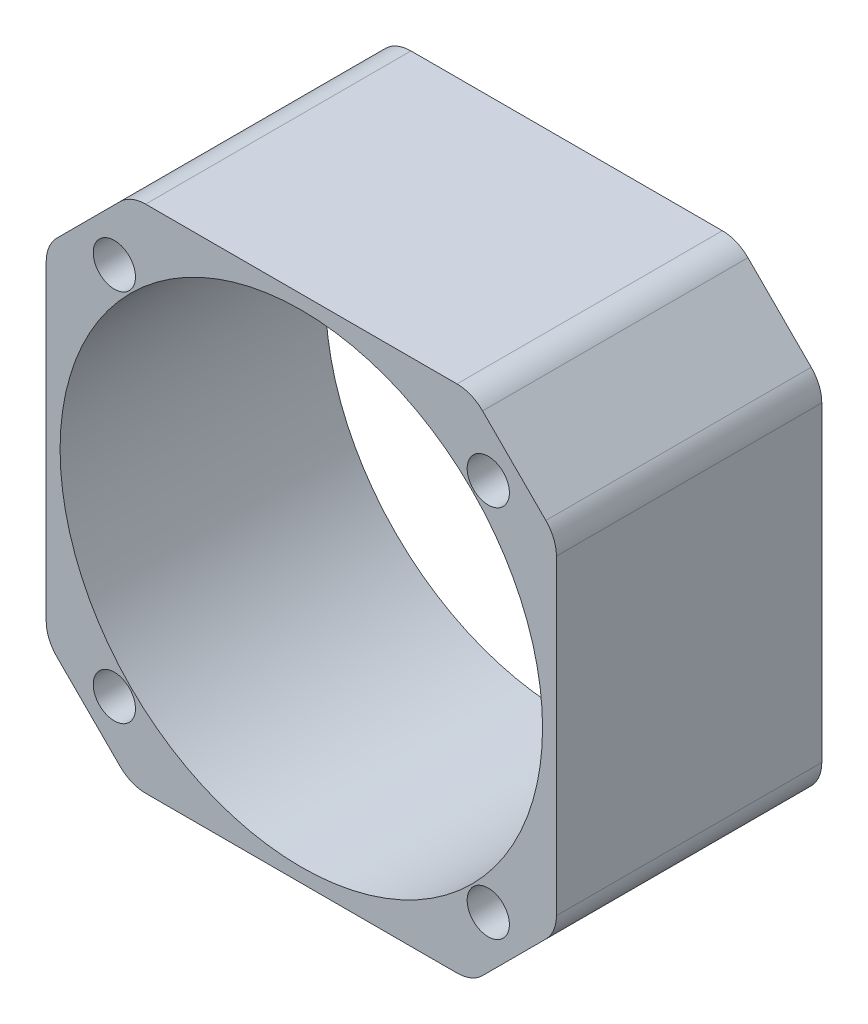
ISO-10303-21;
HEADER;
FILE_DESCRIPTION(('STEP AP214'),'2;1');
FILE_NAME('part.step','',(''),(''),'','','');
FILE_SCHEMA(('AUTOMOTIVE_DESIGN { 1 0 10303 214 1 1 1 1 }'));
ENDSEC;
DATA;
#1=APPLICATION_CONTEXT('core data for automotive mechanical design processes');
#2=APPLICATION_PROTOCOL_DEFINITION('international standard','automotive_design',2000,#1);
#3=PRODUCT_CONTEXT('',#1,'mechanical');
#4=PRODUCT('Part','Part','',(#3));
#5=PRODUCT_RELATED_PRODUCT_CATEGORY('part','',(#4));
#6=PRODUCT_DEFINITION_FORMATION('','',#4);
#7=PRODUCT_DEFINITION_CONTEXT('part definition',#1,'design');
#8=PRODUCT_DEFINITION('design','',#6,#7);
#9=PRODUCT_DEFINITION_SHAPE('','',#8);
#10=(LENGTH_UNIT() NAMED_UNIT(*) SI_UNIT(.MILLI.,.METRE.));
#11=(NAMED_UNIT(*) PLANE_ANGLE_UNIT() SI_UNIT($,.RADIAN.));
#12=(NAMED_UNIT(*) SI_UNIT($,.STERADIAN.) SOLID_ANGLE_UNIT());
#13=UNCERTAINTY_MEASURE_WITH_UNIT(LENGTH_MEASURE(1.E-05),#10,'distance_accuracy_value','');
#14=(GEOMETRIC_REPRESENTATION_CONTEXT(3) GLOBAL_UNCERTAINTY_ASSIGNED_CONTEXT((#13)) GLOBAL_UNIT_ASSIGNED_CONTEXT((#10,
#11,#12)) REPRESENTATION_CONTEXT('',''));
#15=CARTESIAN_POINT('',(0.,0.,0.));
#16=DIRECTION('',(0.,0.,1.));
#17=DIRECTION('',(1.,0.,0.));
#18=AXIS2_PLACEMENT_3D('',#15,#16,#17);
#19=CARTESIAN_POINT('',(21.15,-21.15,22.));
#20=DIRECTION('',(-1.,0.,0.));
#21=DIRECTION('',(0.,0.,1.));
#22=AXIS2_PLACEMENT_3D('',#19,#20,#21);
#23=PLANE('',#22);
#24=DIRECTION('',(0.,1.,0.));
#25=VECTOR('',#24,1.);
#26=CARTESIAN_POINT('',(21.15,-21.15,22.));
#27=LINE('',#26,#25);
#28=CARTESIAN_POINT('',(21.15,-12.9073593128807,22.));
#29=VERTEX_POINT('',#28);
#30=CARTESIAN_POINT('',(21.15,12.9073593128807,22.));
#31=VERTEX_POINT('',#30);
#32=EDGE_CURVE('E263',#29,#31,#27,.T.);
#33=ORIENTED_EDGE('',*,*,#32,.F.);
#34=DIRECTION('',(0.,0.,1.));
#35=VECTOR('',#34,1.);
#36=CARTESIAN_POINT('',(21.15,-12.9073593128807,0.));
#37=LINE('',#36,#35);
#38=CARTESIAN_POINT('',(21.15,-12.9073593128807,0.));
#39=VERTEX_POINT('',#38);
#40=EDGE_CURVE('E212',#29,#39,#37,.F.);
#41=ORIENTED_EDGE('',*,*,#40,.T.);
#42=DIRECTION('',(0.,1.,0.));
#43=VECTOR('',#42,1.);
#44=CARTESIAN_POINT('',(21.15,-21.15,0.));
#45=LINE('',#44,#43);
#46=CARTESIAN_POINT('',(21.15,12.9073593128807,0.));
#47=VERTEX_POINT('',#46);
#48=EDGE_CURVE('E261',#39,#47,#45,.T.);
#49=ORIENTED_EDGE('',*,*,#48,.T.);
#50=DIRECTION('',(0.,0.,-1.));
#51=VECTOR('',#50,1.);
#52=CARTESIAN_POINT('',(21.15,12.9073593128807,22.));
#53=LINE('',#52,#51);
#54=EDGE_CURVE('E209',#47,#31,#53,.F.);
#55=ORIENTED_EDGE('',*,*,#54,.T.);
#56=EDGE_LOOP('',(#33,#41,#49,#55));
#57=FACE_BOUND('',#56,.T.);
#58=ADVANCED_FACE('F32',(#57),#23,.F.);
#59=CARTESIAN_POINT('',(-21.15,21.15,22.));
#60=DIRECTION('',(0.,-1.,0.));
#61=DIRECTION('',(0.,0.,-1.));
#62=AXIS2_PLACEMENT_3D('',#59,#60,#61);
#63=PLANE('',#62);
#64=DIRECTION('',(-1.,0.,0.));
#65=VECTOR('',#64,1.);
#66=CARTESIAN_POINT('',(-21.15,21.15,22.));
#67=LINE('',#66,#65);
#68=CARTESIAN_POINT('',(12.9073593128807,21.15,22.));
#69=VERTEX_POINT('',#68);
#70=CARTESIAN_POINT('',(-12.9073593128807,21.15,22.));
#71=VERTEX_POINT('',#70);
#72=EDGE_CURVE('E295',#69,#71,#67,.T.);
#73=ORIENTED_EDGE('',*,*,#72,.F.);
#74=DIRECTION('',(0.,0.,1.));
#75=VECTOR('',#74,1.);
#76=CARTESIAN_POINT('',(12.9073593128807,21.15,0.));
#77=LINE('',#76,#75);
#78=CARTESIAN_POINT('',(12.9073593128807,21.15,0.));
#79=VERTEX_POINT('',#78);
#80=EDGE_CURVE('E221',#69,#79,#77,.F.);
#81=ORIENTED_EDGE('',*,*,#80,.T.);
#82=DIRECTION('',(-1.,0.,0.));
#83=VECTOR('',#82,1.);
#84=CARTESIAN_POINT('',(-21.15,21.15,0.));
#85=LINE('',#84,#83);
#86=CARTESIAN_POINT('',(-12.9073593128807,21.15,0.));
#87=VERTEX_POINT('',#86);
#88=EDGE_CURVE('E266',#79,#87,#85,.T.);
#89=ORIENTED_EDGE('',*,*,#88,.T.);
#90=DIRECTION('',(0.,0.,-1.));
#91=VECTOR('',#90,1.);
#92=CARTESIAN_POINT('',(-12.9073593128807,21.15,22.));
#93=LINE('',#92,#91);
#94=EDGE_CURVE('E218',#87,#71,#93,.F.);
#95=ORIENTED_EDGE('',*,*,#94,.T.);
#96=EDGE_LOOP('',(#73,#81,#89,#95));
#97=FACE_BOUND('',#96,.T.);
#98=ADVANCED_FACE('F294',(#97),#63,.F.);
#99=CARTESIAN_POINT('',(-21.15,-21.15,22.));
#100=DIRECTION('',(1.,0.,0.));
#101=DIRECTION('',(0.,0.,-1.));
#102=AXIS2_PLACEMENT_3D('',#99,#100,#101);
#103=PLANE('',#102);
#104=DIRECTION('',(0.,-1.,0.));
#105=VECTOR('',#104,1.);
#106=CARTESIAN_POINT('',(-21.15,-21.15,22.));
#107=LINE('',#106,#105);
#108=CARTESIAN_POINT('',(-21.15,12.9073593128807,22.));
#109=VERTEX_POINT('',#108);
#110=CARTESIAN_POINT('',(-21.15,-12.9073593128807,22.));
#111=VERTEX_POINT('',#110);
#112=EDGE_CURVE('E170',#109,#111,#107,.T.);
#113=ORIENTED_EDGE('',*,*,#112,.F.);
#114=DIRECTION('',(0.,0.,1.));
#115=VECTOR('',#114,1.);
#116=CARTESIAN_POINT('',(-21.15,12.9073593128807,0.));
#117=LINE('',#116,#115);
#118=CARTESIAN_POINT('',(-21.15,12.9073593128807,0.));
#119=VERTEX_POINT('',#118);
#120=EDGE_CURVE('E227',#109,#119,#117,.F.);
#121=ORIENTED_EDGE('',*,*,#120,.T.);
#122=DIRECTION('',(0.,-1.,0.));
#123=VECTOR('',#122,1.);
#124=CARTESIAN_POINT('',(-21.15,-21.15,0.));
#125=LINE('',#124,#123);
#126=CARTESIAN_POINT('',(-21.15,-12.9073593128807,0.));
#127=VERTEX_POINT('',#126);
#128=EDGE_CURVE('E270',#119,#127,#125,.T.);
#129=ORIENTED_EDGE('',*,*,#128,.T.);
#130=DIRECTION('',(0.,0.,-1.));
#131=VECTOR('',#130,1.);
#132=CARTESIAN_POINT('',(-21.15,-12.9073593128807,22.));
#133=LINE('',#132,#131);
#134=EDGE_CURVE('E224',#127,#111,#133,.F.);
#135=ORIENTED_EDGE('',*,*,#134,.T.);
#136=EDGE_LOOP('',(#113,#121,#129,#135));
#137=FACE_BOUND('',#136,.T.);
#138=ADVANCED_FACE('F356',(#137),#103,.F.);
#139=CARTESIAN_POINT('',(-21.15,-21.15,22.));
#140=DIRECTION('',(0.,1.,0.));
#141=DIRECTION('',(0.,0.,1.));
#142=AXIS2_PLACEMENT_3D('',#139,#140,#141);
#143=PLANE('',#142);
#144=DIRECTION('',(1.,0.,0.));
#145=VECTOR('',#144,1.);
#146=CARTESIAN_POINT('',(-21.15,-21.15,0.));
#147=LINE('',#146,#145);
#148=CARTESIAN_POINT('',(-12.9073593128807,-21.15,0.));
#149=VERTEX_POINT('',#148);
#150=CARTESIAN_POINT('',(12.9073593128807,-21.15,0.));
#151=VERTEX_POINT('',#150);
#152=EDGE_CURVE('E279',#149,#151,#147,.T.);
#153=ORIENTED_EDGE('',*,*,#152,.T.);
#154=DIRECTION('',(0.,0.,-1.));
#155=VECTOR('',#154,1.);
#156=CARTESIAN_POINT('',(12.9073593128807,-21.15,22.));
#157=LINE('',#156,#155);
#158=CARTESIAN_POINT('',(12.9073593128807,-21.15,22.));
#159=VERTEX_POINT('',#158);
#160=EDGE_CURVE('E168',#151,#159,#157,.F.);
#161=ORIENTED_EDGE('',*,*,#160,.T.);
#162=DIRECTION('',(1.,0.,0.));
#163=VECTOR('',#162,1.);
#164=CARTESIAN_POINT('',(-21.15,-21.15,22.));
#165=LINE('',#164,#163);
#166=CARTESIAN_POINT('',(-12.9073593128807,-21.15,22.));
#167=VERTEX_POINT('',#166);
#168=EDGE_CURVE('E151',#167,#159,#165,.T.);
#169=ORIENTED_EDGE('',*,*,#168,.F.);
#170=DIRECTION('',(0.,0.,1.));
#171=VECTOR('',#170,1.);
#172=CARTESIAN_POINT('',(-12.9073593128807,-21.15,0.));
#173=LINE('',#172,#171);
#174=EDGE_CURVE('E165',#167,#149,#173,.F.);
#175=ORIENTED_EDGE('',*,*,#174,.T.);
#176=EDGE_LOOP('',(#153,#161,#169,#175));
#177=FACE_BOUND('',#176,.T.);
#178=ADVANCED_FACE('F164',(#177),#143,.F.);
#179=CARTESIAN_POINT('',(0.,0.,22.));
#180=DIRECTION('',(0.,0.,-1.));
#181=DIRECTION('',(-1.,0.,0.));
#182=AXIS2_PLACEMENT_3D('',#179,#180,#181);
#183=PLANE('',#182);
#184=CARTESIAN_POINT('',(-15.5,-15.5,22.));
#185=DIRECTION('',(0.,0.,1.));
#186=DIRECTION('',(1.,0.,0.));
#187=AXIS2_PLACEMENT_3D('',#184,#185,#186);
#188=CIRCLE('',#187,1.75);
#189=CARTESIAN_POINT('',(-13.75,-15.5,22.));
#190=VERTEX_POINT('',#189);
#191=EDGE_CURVE('E309',#190,#190,#188,.T.);
#192=ORIENTED_EDGE('',*,*,#191,.F.);
#193=EDGE_LOOP('',(#192));
#194=FACE_BOUND('',#193,.T.);
#195=CARTESIAN_POINT('',(15.5,-15.5,22.));
#196=DIRECTION('',(0.,0.,1.));
#197=DIRECTION('',(1.,0.,0.));
#198=AXIS2_PLACEMENT_3D('',#195,#196,#197);
#199=CIRCLE('',#198,1.75);
#200=CARTESIAN_POINT('',(17.25,-15.5,22.));
#201=VERTEX_POINT('',#200);
#202=EDGE_CURVE('E315',#201,#201,#199,.T.);
#203=ORIENTED_EDGE('',*,*,#202,.F.);
#204=EDGE_LOOP('',(#203));
#205=FACE_BOUND('',#204,.T.);
#206=CARTESIAN_POINT('',(15.5,15.5,22.));
#207=DIRECTION('',(0.,0.,1.));
#208=DIRECTION('',(1.,0.,0.));
#209=AXIS2_PLACEMENT_3D('',#206,#207,#208);
#210=CIRCLE('',#209,1.75);
#211=CARTESIAN_POINT('',(17.25,15.5,22.));
#212=VERTEX_POINT('',#211);
#213=EDGE_CURVE('E321',#212,#212,#210,.T.);
#214=ORIENTED_EDGE('',*,*,#213,.F.);
#215=EDGE_LOOP('',(#214));
#216=FACE_BOUND('',#215,.T.);
#217=CARTESIAN_POINT('',(-15.5,15.5,22.));
#218=DIRECTION('',(0.,0.,1.));
#219=DIRECTION('',(1.,0.,0.));
#220=AXIS2_PLACEMENT_3D('',#217,#218,#219);
#221=CIRCLE('',#220,1.75);
#222=CARTESIAN_POINT('',(-13.75,15.5,22.));
#223=VERTEX_POINT('',#222);
#224=EDGE_CURVE('E304',#223,#223,#221,.T.);
#225=ORIENTED_EDGE('',*,*,#224,.F.);
#226=EDGE_LOOP('',(#225));
#227=FACE_BOUND('',#226,.T.);
#228=CARTESIAN_POINT('',(0.,0.,22.));
#229=DIRECTION('',(0.,0.,1.));
#230=DIRECTION('',(1.,0.,0.));
#231=AXIS2_PLACEMENT_3D('',#228,#229,#230);
#232=CIRCLE('',#231,20.);
#233=CARTESIAN_POINT('',(20.,0.,22.));
#234=VERTEX_POINT('',#233);
#235=EDGE_CURVE('E267',#234,#234,#232,.T.);
#236=ORIENTED_EDGE('',*,*,#235,.F.);
#237=EDGE_LOOP('',(#236));
#238=FACE_BOUND('',#237,.T.);
#239=ORIENTED_EDGE('',*,*,#168,.T.);
#240=CARTESIAN_POINT('',(12.9073593128807,-18.15,22.));
#241=DIRECTION('',(0.,0.,-1.));
#242=DIRECTION('',(-1.,0.,0.));
#243=AXIS2_PLACEMENT_3D('',#240,#241,#242);
#244=CIRCLE('',#243,3.);
#245=CARTESIAN_POINT('',(15.0286796564403,-20.2713203435596,22.));
#246=VERTEX_POINT('',#245);
#247=EDGE_CURVE('E190',#159,#246,#244,.F.);
#248=ORIENTED_EDGE('',*,*,#247,.T.);
#249=DIRECTION('',(-0.707106781186549,-0.707106781186546,0.));
#250=VECTOR('',#249,1.);
#251=CARTESIAN_POINT('',(21.15,-14.15,22.));
#252=LINE('',#251,#250);
#253=CARTESIAN_POINT('',(20.2713203435596,-15.0286796564404,22.));
#254=VERTEX_POINT('',#253);
#255=EDGE_CURVE('E176',#246,#254,#252,.F.);
#256=ORIENTED_EDGE('',*,*,#255,.T.);
#257=CARTESIAN_POINT('',(18.15,-12.9073593128807,22.));
#258=DIRECTION('',(0.,0.,-1.));
#259=DIRECTION('',(-1.,0.,0.));
#260=AXIS2_PLACEMENT_3D('',#257,#258,#259);
#261=CIRCLE('',#260,3.);
#262=EDGE_CURVE('E188',#254,#29,#261,.F.);
#263=ORIENTED_EDGE('',*,*,#262,.T.);
#264=ORIENTED_EDGE('',*,*,#32,.T.);
#265=CARTESIAN_POINT('',(18.15,12.9073593128807,22.));
#266=DIRECTION('',(0.,0.,-1.));
#267=DIRECTION('',(-1.,0.,0.));
#268=AXIS2_PLACEMENT_3D('',#265,#266,#267);
#269=CIRCLE('',#268,3.);
#270=CARTESIAN_POINT('',(20.2713203435596,15.0286796564403,22.));
#271=VERTEX_POINT('',#270);
#272=EDGE_CURVE('E186',#31,#271,#269,.F.);
#273=ORIENTED_EDGE('',*,*,#272,.T.);
#274=DIRECTION('',(0.707106781186546,-0.707106781186549,0.));
#275=VECTOR('',#274,1.);
#276=CARTESIAN_POINT('',(14.15,21.15,22.));
#277=LINE('',#276,#275);
#278=CARTESIAN_POINT('',(15.0286796564404,20.2713203435596,22.));
#279=VERTEX_POINT('',#278);
#280=EDGE_CURVE('E240',#271,#279,#277,.F.);
#281=ORIENTED_EDGE('',*,*,#280,.T.);
#282=CARTESIAN_POINT('',(12.9073593128807,18.15,22.));
#283=DIRECTION('',(0.,0.,-1.));
#284=DIRECTION('',(-1.,0.,0.));
#285=AXIS2_PLACEMENT_3D('',#282,#283,#284);
#286=CIRCLE('',#285,3.);
#287=EDGE_CURVE('E184',#279,#69,#286,.F.);
#288=ORIENTED_EDGE('',*,*,#287,.T.);
#289=ORIENTED_EDGE('',*,*,#72,.T.);
#290=CARTESIAN_POINT('',(-12.9073593128807,18.15,22.));
#291=DIRECTION('',(0.,0.,-1.));
#292=DIRECTION('',(-1.,0.,0.));
#293=AXIS2_PLACEMENT_3D('',#290,#291,#292);
#294=CIRCLE('',#293,3.);
#295=CARTESIAN_POINT('',(-15.0286796564403,20.2713203435596,22.));
#296=VERTEX_POINT('',#295);
#297=EDGE_CURVE('E158',#71,#296,#294,.F.);
#298=ORIENTED_EDGE('',*,*,#297,.T.);
#299=DIRECTION('',(0.707106781186549,0.707106781186546,0.));
#300=VECTOR('',#299,1.);
#301=CARTESIAN_POINT('',(-21.15,14.15,22.));
#302=LINE('',#301,#300);
#303=CARTESIAN_POINT('',(-20.2713203435596,15.0286796564404,22.));
#304=VERTEX_POINT('',#303);
#305=EDGE_CURVE('E244',#296,#304,#302,.F.);
#306=ORIENTED_EDGE('',*,*,#305,.T.);
#307=CARTESIAN_POINT('',(-18.15,12.9073593128807,22.));
#308=DIRECTION('',(0.,0.,-1.));
#309=DIRECTION('',(-1.,0.,0.));
#310=AXIS2_PLACEMENT_3D('',#307,#308,#309);
#311=CIRCLE('',#310,3.);
#312=EDGE_CURVE('E182',#304,#109,#311,.F.);
#313=ORIENTED_EDGE('',*,*,#312,.T.);
#314=ORIENTED_EDGE('',*,*,#112,.T.);
#315=CARTESIAN_POINT('',(-18.15,-12.9073593128807,22.));
#316=DIRECTION('',(0.,0.,-1.));
#317=DIRECTION('',(-1.,0.,0.));
#318=AXIS2_PLACEMENT_3D('',#315,#316,#317);
#319=CIRCLE('',#318,3.);
#320=CARTESIAN_POINT('',(-20.2713203435596,-15.0286796564403,22.));
#321=VERTEX_POINT('',#320);
#322=EDGE_CURVE('E157',#111,#321,#319,.F.);
#323=ORIENTED_EDGE('',*,*,#322,.T.);
#324=DIRECTION('',(-0.707106781186546,0.707106781186549,0.));
#325=VECTOR('',#324,1.);
#326=CARTESIAN_POINT('',(-14.15,-21.15,22.));
#327=LINE('',#326,#325);
#328=CARTESIAN_POINT('',(-15.0286796564404,-20.2713203435596,22.));
#329=VERTEX_POINT('',#328);
#330=EDGE_CURVE('E153',#321,#329,#327,.F.);
#331=ORIENTED_EDGE('',*,*,#330,.T.);
#332=CARTESIAN_POINT('',(-12.9073593128807,-18.15,22.));
#333=DIRECTION('',(0.,0.,-1.));
#334=DIRECTION('',(-1.,0.,0.));
#335=AXIS2_PLACEMENT_3D('',#332,#333,#334);
#336=CIRCLE('',#335,3.);
#337=EDGE_CURVE('E148',#329,#167,#336,.F.);
#338=ORIENTED_EDGE('',*,*,#337,.T.);
#339=EDGE_LOOP('',(#239,#248,#256,#263,#264,#273,#281,#288,#289,#298,#306,#313,#314,#323,#331,#338));
#340=FACE_BOUND('',#339,.T.);
#341=ADVANCED_FACE('F150',(#194,#205,#216,#227,#238,#340),#183,.F.);
#342=CARTESIAN_POINT('',(0.,0.,0.));
#343=DIRECTION('',(0.,0.,-1.));
#344=DIRECTION('',(-1.,0.,0.));
#345=AXIS2_PLACEMENT_3D('',#342,#343,#344);
#346=PLANE('',#345);
#347=CARTESIAN_POINT('',(-15.5,-15.5,0.));
#348=DIRECTION('',(0.,0.,-1.));
#349=DIRECTION('',(-1.,0.,0.));
#350=AXIS2_PLACEMENT_3D('',#347,#348,#349);
#351=CIRCLE('',#350,1.75);
#352=CARTESIAN_POINT('',(-17.25,-15.5,0.));
#353=VERTEX_POINT('',#352);
#354=EDGE_CURVE('E306',#353,#353,#351,.F.);
#355=ORIENTED_EDGE('',*,*,#354,.T.);
#356=EDGE_LOOP('',(#355));
#357=FACE_BOUND('',#356,.T.);
#358=CARTESIAN_POINT('',(15.5,-15.5,0.));
#359=DIRECTION('',(0.,0.,-1.));
#360=DIRECTION('',(-1.,0.,0.));
#361=AXIS2_PLACEMENT_3D('',#358,#359,#360);
#362=CIRCLE('',#361,1.75);
#363=CARTESIAN_POINT('',(13.75,-15.5,0.));
#364=VERTEX_POINT('',#363);
#365=EDGE_CURVE('E312',#364,#364,#362,.F.);
#366=ORIENTED_EDGE('',*,*,#365,.T.);
#367=EDGE_LOOP('',(#366));
#368=FACE_BOUND('',#367,.T.);
#369=CARTESIAN_POINT('',(15.5,15.5,0.));
#370=DIRECTION('',(0.,0.,-1.));
#371=DIRECTION('',(-1.,0.,0.));
#372=AXIS2_PLACEMENT_3D('',#369,#370,#371);
#373=CIRCLE('',#372,1.75);
#374=CARTESIAN_POINT('',(13.75,15.5,0.));
#375=VERTEX_POINT('',#374);
#376=EDGE_CURVE('E318',#375,#375,#373,.F.);
#377=ORIENTED_EDGE('',*,*,#376,.T.);
#378=EDGE_LOOP('',(#377));
#379=FACE_BOUND('',#378,.T.);
#380=CARTESIAN_POINT('',(-15.5,15.5,0.));
#381=DIRECTION('',(0.,0.,-1.));
#382=DIRECTION('',(-1.,0.,0.));
#383=AXIS2_PLACEMENT_3D('',#380,#381,#382);
#384=CIRCLE('',#383,1.75);
#385=CARTESIAN_POINT('',(-17.25,15.5,0.));
#386=VERTEX_POINT('',#385);
#387=EDGE_CURVE('E324',#386,#386,#384,.F.);
#388=ORIENTED_EDGE('',*,*,#387,.T.);
#389=EDGE_LOOP('',(#388));
#390=FACE_BOUND('',#389,.T.);
#391=CARTESIAN_POINT('',(0.,0.,0.));
#392=DIRECTION('',(0.,0.,-1.));
#393=DIRECTION('',(-1.,0.,0.));
#394=AXIS2_PLACEMENT_3D('',#391,#392,#393);
#395=CIRCLE('',#394,20.);
#396=CARTESIAN_POINT('',(-20.,0.,0.));
#397=VERTEX_POINT('',#396);
#398=EDGE_CURVE('E273',#397,#397,#395,.F.);
#399=ORIENTED_EDGE('',*,*,#398,.T.);
#400=EDGE_LOOP('',(#399));
#401=FACE_BOUND('',#400,.T.);
#402=DIRECTION('',(0.707106781186549,0.707106781186546,0.));
#403=VECTOR('',#402,1.);
#404=CARTESIAN_POINT('',(17.65,-17.65,0.));
#405=LINE('',#404,#403);
#406=CARTESIAN_POINT('',(20.2713203435596,-15.0286796564404,0.));
#407=VERTEX_POINT('',#406);
#408=CARTESIAN_POINT('',(15.0286796564403,-20.2713203435596,0.));
#409=VERTEX_POINT('',#408);
#410=EDGE_CURVE('E241',#407,#409,#405,.F.);
#411=ORIENTED_EDGE('',*,*,#410,.T.);
#412=CARTESIAN_POINT('',(12.9073593128807,-18.15,0.));
#413=DIRECTION('',(0.,0.,-1.));
#414=DIRECTION('',(-1.,0.,0.));
#415=AXIS2_PLACEMENT_3D('',#412,#413,#414);
#416=CIRCLE('',#415,3.);
#417=EDGE_CURVE('E207',#409,#151,#416,.T.);
#418=ORIENTED_EDGE('',*,*,#417,.T.);
#419=ORIENTED_EDGE('',*,*,#152,.F.);
#420=CARTESIAN_POINT('',(-12.9073593128807,-18.15,0.));
#421=DIRECTION('',(0.,0.,-1.));
#422=DIRECTION('',(-1.,0.,0.));
#423=AXIS2_PLACEMENT_3D('',#420,#421,#422);
#424=CIRCLE('',#423,3.);
#425=CARTESIAN_POINT('',(-15.0286796564404,-20.2713203435596,0.));
#426=VERTEX_POINT('',#425);
#427=EDGE_CURVE('E173',#149,#426,#424,.T.);
#428=ORIENTED_EDGE('',*,*,#427,.T.);
#429=DIRECTION('',(0.707106781186546,-0.707106781186549,0.));
#430=VECTOR('',#429,1.);
#431=CARTESIAN_POINT('',(-17.65,-17.65,0.));
#432=LINE('',#431,#430);
#433=CARTESIAN_POINT('',(-20.2713203435596,-15.0286796564403,0.));
#434=VERTEX_POINT('',#433);
#435=EDGE_CURVE('E238',#426,#434,#432,.F.);
#436=ORIENTED_EDGE('',*,*,#435,.T.);
#437=CARTESIAN_POINT('',(-18.15,-12.9073593128807,0.));
#438=DIRECTION('',(0.,0.,-1.));
#439=DIRECTION('',(-1.,0.,0.));
#440=AXIS2_PLACEMENT_3D('',#437,#438,#439);
#441=CIRCLE('',#440,3.);
#442=EDGE_CURVE('E199',#434,#127,#441,.T.);
#443=ORIENTED_EDGE('',*,*,#442,.T.);
#444=ORIENTED_EDGE('',*,*,#128,.F.);
#445=CARTESIAN_POINT('',(-18.15,12.9073593128807,0.));
#446=DIRECTION('',(0.,0.,-1.));
#447=DIRECTION('',(-1.,0.,0.));
#448=AXIS2_PLACEMENT_3D('',#445,#446,#447);
#449=CIRCLE('',#448,3.);
#450=CARTESIAN_POINT('',(-20.2713203435596,15.0286796564404,0.));
#451=VERTEX_POINT('',#450);
#452=EDGE_CURVE('E201',#119,#451,#449,.T.);
#453=ORIENTED_EDGE('',*,*,#452,.T.);
#454=DIRECTION('',(-0.707106781186549,-0.707106781186546,0.));
#455=VECTOR('',#454,1.);
#456=CARTESIAN_POINT('',(-17.65,17.65,0.));
#457=LINE('',#456,#455);
#458=CARTESIAN_POINT('',(-15.0286796564403,20.2713203435596,0.));
#459=VERTEX_POINT('',#458);
#460=EDGE_CURVE('E247',#451,#459,#457,.F.);
#461=ORIENTED_EDGE('',*,*,#460,.T.);
#462=CARTESIAN_POINT('',(-12.9073593128807,18.15,0.));
#463=DIRECTION('',(0.,0.,-1.));
#464=DIRECTION('',(-1.,0.,0.));
#465=AXIS2_PLACEMENT_3D('',#462,#463,#464);
#466=CIRCLE('',#465,3.);
#467=EDGE_CURVE('E196',#459,#87,#466,.T.);
#468=ORIENTED_EDGE('',*,*,#467,.T.);
#469=ORIENTED_EDGE('',*,*,#88,.F.);
#470=CARTESIAN_POINT('',(12.9073593128807,18.15,0.));
#471=DIRECTION('',(0.,0.,-1.));
#472=DIRECTION('',(-1.,0.,0.));
#473=AXIS2_PLACEMENT_3D('',#470,#471,#472);
#474=CIRCLE('',#473,3.);
#475=CARTESIAN_POINT('',(15.0286796564404,20.2713203435596,0.));
#476=VERTEX_POINT('',#475);
#477=EDGE_CURVE('E203',#79,#476,#474,.T.);
#478=ORIENTED_EDGE('',*,*,#477,.T.);
#479=DIRECTION('',(-0.707106781186546,0.707106781186549,0.));
#480=VECTOR('',#479,1.);
#481=CARTESIAN_POINT('',(17.65,17.65,0.));
#482=LINE('',#481,#480);
#483=CARTESIAN_POINT('',(20.2713203435596,15.0286796564403,0.));
#484=VERTEX_POINT('',#483);
#485=EDGE_CURVE('E169',#476,#484,#482,.F.);
#486=ORIENTED_EDGE('',*,*,#485,.T.);
#487=CARTESIAN_POINT('',(18.15,12.9073593128807,0.));
#488=DIRECTION('',(0.,0.,-1.));
#489=DIRECTION('',(-1.,0.,0.));
#490=AXIS2_PLACEMENT_3D('',#487,#488,#489);
#491=CIRCLE('',#490,3.);
#492=EDGE_CURVE('E47',#484,#47,#491,.T.);
#493=ORIENTED_EDGE('',*,*,#492,.T.);
#494=ORIENTED_EDGE('',*,*,#48,.F.);
#495=CARTESIAN_POINT('',(18.15,-12.9073593128807,0.));
#496=DIRECTION('',(0.,0.,-1.));
#497=DIRECTION('',(-1.,0.,0.));
#498=AXIS2_PLACEMENT_3D('',#495,#496,#497);
#499=CIRCLE('',#498,3.);
#500=EDGE_CURVE('E55',#39,#407,#499,.T.);
#501=ORIENTED_EDGE('',*,*,#500,.T.);
#502=EDGE_LOOP('',(#411,#418,#419,#428,#436,#443,#444,#453,#461,#468,#469,#478,#486,#493,#494,#501));
#503=FACE_BOUND('',#502,.T.);
#504=ADVANCED_FACE('F264',(#357,#368,#379,#390,#401,#503),#346,.T.);
#505=CARTESIAN_POINT('',(-14.15,-21.15,22.));
#506=DIRECTION('',(0.707106781186549,0.707106781186546,0.));
#507=DIRECTION('',(0.,0.,-1.));
#508=AXIS2_PLACEMENT_3D('',#505,#506,#507);
#509=PLANE('',#508);
#510=ORIENTED_EDGE('',*,*,#330,.F.);
#511=DIRECTION('',(0.,0.,1.));
#512=VECTOR('',#511,1.);
#513=CARTESIAN_POINT('',(-20.2713203435596,-15.0286796564403,0.));
#514=LINE('',#513,#512);
#515=EDGE_CURVE('E11',#321,#434,#514,.F.);
#516=ORIENTED_EDGE('',*,*,#515,.T.);
#517=ORIENTED_EDGE('',*,*,#435,.F.);
#518=DIRECTION('',(0.,0.,-1.));
#519=VECTOR('',#518,1.);
#520=CARTESIAN_POINT('',(-15.0286796564404,-20.2713203435596,22.));
#521=LINE('',#520,#519);
#522=EDGE_CURVE('E40',#426,#329,#521,.F.);
#523=ORIENTED_EDGE('',*,*,#522,.T.);
#524=EDGE_LOOP('',(#510,#516,#517,#523));
#525=FACE_BOUND('',#524,.T.);
#526=ADVANCED_FACE('F235',(#525),#509,.F.);
#527=CARTESIAN_POINT('',(21.15,-14.15,22.));
#528=DIRECTION('',(-0.707106781186546,0.707106781186549,0.));
#529=DIRECTION('',(0.,0.,-1.));
#530=AXIS2_PLACEMENT_3D('',#527,#528,#529);
#531=PLANE('',#530);
#532=ORIENTED_EDGE('',*,*,#255,.F.);
#533=DIRECTION('',(0.,0.,1.));
#534=VECTOR('',#533,1.);
#535=CARTESIAN_POINT('',(15.0286796564403,-20.2713203435596,0.));
#536=LINE('',#535,#534);
#537=EDGE_CURVE('E194',#246,#409,#536,.F.);
#538=ORIENTED_EDGE('',*,*,#537,.T.);
#539=ORIENTED_EDGE('',*,*,#410,.F.);
#540=DIRECTION('',(0.,0.,-1.));
#541=VECTOR('',#540,1.);
#542=CARTESIAN_POINT('',(20.2713203435596,-15.0286796564404,22.));
#543=LINE('',#542,#541);
#544=EDGE_CURVE('E192',#407,#254,#543,.F.);
#545=ORIENTED_EDGE('',*,*,#544,.T.);
#546=EDGE_LOOP('',(#532,#538,#539,#545));
#547=FACE_BOUND('',#546,.T.);
#548=ADVANCED_FACE('F362',(#547),#531,.F.);
#549=CARTESIAN_POINT('',(-21.15,14.15,22.));
#550=DIRECTION('',(0.707106781186546,-0.707106781186549,0.));
#551=DIRECTION('',(0.,0.,-1.));
#552=AXIS2_PLACEMENT_3D('',#549,#550,#551);
#553=PLANE('',#552);
#554=ORIENTED_EDGE('',*,*,#460,.F.);
#555=DIRECTION('',(0.,0.,-1.));
#556=VECTOR('',#555,1.);
#557=CARTESIAN_POINT('',(-20.2713203435596,15.0286796564404,22.));
#558=LINE('',#557,#556);
#559=EDGE_CURVE('E232',#451,#304,#558,.F.);
#560=ORIENTED_EDGE('',*,*,#559,.T.);
#561=ORIENTED_EDGE('',*,*,#305,.F.);
#562=DIRECTION('',(0.,0.,1.));
#563=VECTOR('',#562,1.);
#564=CARTESIAN_POINT('',(-15.0286796564403,20.2713203435596,0.));
#565=LINE('',#564,#563);
#566=EDGE_CURVE('E230',#296,#459,#565,.F.);
#567=ORIENTED_EDGE('',*,*,#566,.T.);
#568=EDGE_LOOP('',(#554,#560,#561,#567));
#569=FACE_BOUND('',#568,.T.);
#570=ADVANCED_FACE('F365',(#569),#553,.F.);
#571=CARTESIAN_POINT('',(14.15,21.15,22.));
#572=DIRECTION('',(-0.707106781186549,-0.707106781186546,0.));
#573=DIRECTION('',(0.,0.,-1.));
#574=AXIS2_PLACEMENT_3D('',#571,#572,#573);
#575=PLANE('',#574);
#576=ORIENTED_EDGE('',*,*,#280,.F.);
#577=DIRECTION('',(0.,0.,1.));
#578=VECTOR('',#577,1.);
#579=CARTESIAN_POINT('',(20.2713203435596,15.0286796564403,0.));
#580=LINE('',#579,#578);
#581=EDGE_CURVE('E216',#271,#484,#580,.F.);
#582=ORIENTED_EDGE('',*,*,#581,.T.);
#583=ORIENTED_EDGE('',*,*,#485,.F.);
#584=DIRECTION('',(0.,0.,-1.));
#585=VECTOR('',#584,1.);
#586=CARTESIAN_POINT('',(15.0286796564404,20.2713203435596,22.));
#587=LINE('',#586,#585);
#588=EDGE_CURVE('E214',#476,#279,#587,.F.);
#589=ORIENTED_EDGE('',*,*,#588,.T.);
#590=EDGE_LOOP('',(#576,#582,#583,#589));
#591=FACE_BOUND('',#590,.T.);
#592=ADVANCED_FACE('F368',(#591),#575,.F.);
#593=CARTESIAN_POINT('',(12.9073593128807,-18.15,22.));
#594=DIRECTION('',(0.,0.,1.));
#595=DIRECTION('',(1.,0.,0.));
#596=AXIS2_PLACEMENT_3D('',#593,#594,#595);
#597=CYLINDRICAL_SURFACE('',#596,3.);
#598=ORIENTED_EDGE('',*,*,#417,.F.);
#599=ORIENTED_EDGE('',*,*,#537,.F.);
#600=ORIENTED_EDGE('',*,*,#247,.F.);
#601=ORIENTED_EDGE('',*,*,#160,.F.);
#602=EDGE_LOOP('',(#598,#599,#600,#601));
#603=FACE_BOUND('',#602,.T.);
#604=ADVANCED_FACE('F371',(#603),#597,.T.);
#605=CARTESIAN_POINT('',(18.15,-12.9073593128807,22.));
#606=DIRECTION('',(0.,0.,-1.));
#607=DIRECTION('',(-1.,0.,0.));
#608=AXIS2_PLACEMENT_3D('',#605,#606,#607);
#609=CYLINDRICAL_SURFACE('',#608,3.);
#610=ORIENTED_EDGE('',*,*,#262,.F.);
#611=ORIENTED_EDGE('',*,*,#544,.F.);
#612=ORIENTED_EDGE('',*,*,#500,.F.);
#613=ORIENTED_EDGE('',*,*,#40,.F.);
#614=EDGE_LOOP('',(#610,#611,#612,#613));
#615=FACE_BOUND('',#614,.T.);
#616=ADVANCED_FACE('F259',(#615),#609,.T.);
#617=CARTESIAN_POINT('',(18.15,12.9073593128807,22.));
#618=DIRECTION('',(0.,0.,1.));
#619=DIRECTION('',(1.,0.,0.));
#620=AXIS2_PLACEMENT_3D('',#617,#618,#619);
#621=CYLINDRICAL_SURFACE('',#620,3.);
#622=ORIENTED_EDGE('',*,*,#492,.F.);
#623=ORIENTED_EDGE('',*,*,#581,.F.);
#624=ORIENTED_EDGE('',*,*,#272,.F.);
#625=ORIENTED_EDGE('',*,*,#54,.F.);
#626=EDGE_LOOP('',(#622,#623,#624,#625));
#627=FACE_BOUND('',#626,.T.);
#628=ADVANCED_FACE('F378',(#627),#621,.T.);
#629=CARTESIAN_POINT('',(12.9073593128807,18.15,22.));
#630=DIRECTION('',(0.,0.,-1.));
#631=DIRECTION('',(-1.,0.,0.));
#632=AXIS2_PLACEMENT_3D('',#629,#630,#631);
#633=CYLINDRICAL_SURFACE('',#632,3.);
#634=ORIENTED_EDGE('',*,*,#287,.F.);
#635=ORIENTED_EDGE('',*,*,#588,.F.);
#636=ORIENTED_EDGE('',*,*,#477,.F.);
#637=ORIENTED_EDGE('',*,*,#80,.F.);
#638=EDGE_LOOP('',(#634,#635,#636,#637));
#639=FACE_BOUND('',#638,.T.);
#640=ADVANCED_FACE('F381',(#639),#633,.T.);
#641=CARTESIAN_POINT('',(-18.15,12.9073593128807,22.));
#642=DIRECTION('',(0.,0.,-1.));
#643=DIRECTION('',(-1.,0.,0.));
#644=AXIS2_PLACEMENT_3D('',#641,#642,#643);
#645=CYLINDRICAL_SURFACE('',#644,3.);
#646=ORIENTED_EDGE('',*,*,#312,.F.);
#647=ORIENTED_EDGE('',*,*,#559,.F.);
#648=ORIENTED_EDGE('',*,*,#452,.F.);
#649=ORIENTED_EDGE('',*,*,#120,.F.);
#650=EDGE_LOOP('',(#646,#647,#648,#649));
#651=FACE_BOUND('',#650,.T.);
#652=ADVANCED_FACE('F385',(#651),#645,.T.);
#653=CARTESIAN_POINT('',(-18.15,-12.9073593128807,22.));
#654=DIRECTION('',(0.,0.,1.));
#655=DIRECTION('',(1.,0.,0.));
#656=AXIS2_PLACEMENT_3D('',#653,#654,#655);
#657=CYLINDRICAL_SURFACE('',#656,3.);
#658=ORIENTED_EDGE('',*,*,#442,.F.);
#659=ORIENTED_EDGE('',*,*,#515,.F.);
#660=ORIENTED_EDGE('',*,*,#322,.F.);
#661=ORIENTED_EDGE('',*,*,#134,.F.);
#662=EDGE_LOOP('',(#658,#659,#660,#661));
#663=FACE_BOUND('',#662,.T.);
#664=ADVANCED_FACE('F389',(#663),#657,.T.);
#665=CARTESIAN_POINT('',(-12.9073593128807,-18.15,22.));
#666=DIRECTION('',(0.,0.,-1.));
#667=DIRECTION('',(-1.,0.,0.));
#668=AXIS2_PLACEMENT_3D('',#665,#666,#667);
#669=CYLINDRICAL_SURFACE('',#668,3.);
#670=ORIENTED_EDGE('',*,*,#337,.F.);
#671=ORIENTED_EDGE('',*,*,#522,.F.);
#672=ORIENTED_EDGE('',*,*,#427,.F.);
#673=ORIENTED_EDGE('',*,*,#174,.F.);
#674=EDGE_LOOP('',(#670,#671,#672,#673));
#675=FACE_BOUND('',#674,.T.);
#676=ADVANCED_FACE('F172',(#675),#669,.T.);
#677=CARTESIAN_POINT('',(-12.9073593128807,18.15,22.));
#678=DIRECTION('',(0.,0.,1.));
#679=DIRECTION('',(1.,0.,0.));
#680=AXIS2_PLACEMENT_3D('',#677,#678,#679);
#681=CYLINDRICAL_SURFACE('',#680,3.);
#682=ORIENTED_EDGE('',*,*,#467,.F.);
#683=ORIENTED_EDGE('',*,*,#566,.F.);
#684=ORIENTED_EDGE('',*,*,#297,.F.);
#685=ORIENTED_EDGE('',*,*,#94,.F.);
#686=EDGE_LOOP('',(#682,#683,#684,#685));
#687=FACE_BOUND('',#686,.T.);
#688=ADVANCED_FACE('F34',(#687),#681,.T.);
#689=CARTESIAN_POINT('',(0.,0.,-0.001000000000001));
#690=DIRECTION('',(0.,0.,1.));
#691=DIRECTION('',(1.,0.,0.));
#692=AXIS2_PLACEMENT_3D('',#689,#690,#691);
#693=CYLINDRICAL_SURFACE('',#692,20.);
#694=ORIENTED_EDGE('',*,*,#398,.F.);
#695=EDGE_LOOP('',(#694));
#696=FACE_BOUND('',#695,.T.);
#697=ORIENTED_EDGE('',*,*,#235,.T.);
#698=EDGE_LOOP('',(#697));
#699=FACE_BOUND('',#698,.T.);
#700=ADVANCED_FACE('F338',(#696,#699),#693,.F.);
#701=CARTESIAN_POINT('',(-15.5,15.5,-0.001000000000001));
#702=DIRECTION('',(0.,0.,1.));
#703=DIRECTION('',(1.,0.,0.));
#704=AXIS2_PLACEMENT_3D('',#701,#702,#703);
#705=CYLINDRICAL_SURFACE('',#704,1.75);
#706=ORIENTED_EDGE('',*,*,#387,.F.);
#707=EDGE_LOOP('',(#706));
#708=FACE_BOUND('',#707,.T.);
#709=ORIENTED_EDGE('',*,*,#224,.T.);
#710=EDGE_LOOP('',(#709));
#711=FACE_BOUND('',#710,.T.);
#712=ADVANCED_FACE('F330',(#708,#711),#705,.F.);
#713=CARTESIAN_POINT('',(15.5,15.5,-0.001000000000001));
#714=DIRECTION('',(0.,0.,1.));
#715=DIRECTION('',(1.,0.,0.));
#716=AXIS2_PLACEMENT_3D('',#713,#714,#715);
#717=CYLINDRICAL_SURFACE('',#716,1.75);
#718=ORIENTED_EDGE('',*,*,#376,.F.);
#719=EDGE_LOOP('',(#718));
#720=FACE_BOUND('',#719,.T.);
#721=ORIENTED_EDGE('',*,*,#213,.T.);
#722=EDGE_LOOP('',(#721));
#723=FACE_BOUND('',#722,.T.);
#724=ADVANCED_FACE('F346',(#720,#723),#717,.F.);
#725=CARTESIAN_POINT('',(15.5,-15.5,-0.001000000000001));
#726=DIRECTION('',(0.,0.,1.));
#727=DIRECTION('',(1.,0.,0.));
#728=AXIS2_PLACEMENT_3D('',#725,#726,#727);
#729=CYLINDRICAL_SURFACE('',#728,1.75);
#730=ORIENTED_EDGE('',*,*,#365,.F.);
#731=EDGE_LOOP('',(#730));
#732=FACE_BOUND('',#731,.T.);
#733=ORIENTED_EDGE('',*,*,#202,.T.);
#734=EDGE_LOOP('',(#733));
#735=FACE_BOUND('',#734,.T.);
#736=ADVANCED_FACE('F439',(#732,#735),#729,.F.);
#737=CARTESIAN_POINT('',(-15.5,-15.5,-0.001000000000001));
#738=DIRECTION('',(0.,0.,1.));
#739=DIRECTION('',(1.,0.,0.));
#740=AXIS2_PLACEMENT_3D('',#737,#738,#739);
#741=CYLINDRICAL_SURFACE('',#740,1.75);
#742=ORIENTED_EDGE('',*,*,#354,.F.);
#743=EDGE_LOOP('',(#742));
#744=FACE_BOUND('',#743,.T.);
#745=ORIENTED_EDGE('',*,*,#191,.T.);
#746=EDGE_LOOP('',(#745));
#747=FACE_BOUND('',#746,.T.);
#748=ADVANCED_FACE('F449',(#744,#747),#741,.F.);
#749=CLOSED_SHELL('',(#58,#98,#138,#178,#341,#504,#526,#548,#570,#592,#604,#616,#628,#640,#652,
#664,#676,#688,#700,#712,#724,#736,#748));
#750=MANIFOLD_SOLID_BREP('B2',#749);
#751=ADVANCED_BREP_SHAPE_REPRESENTATION('',(#18,#750),#14);
#752=SHAPE_DEFINITION_REPRESENTATION(#9,#751);
ENDSEC;
END-ISO-10303-21;
